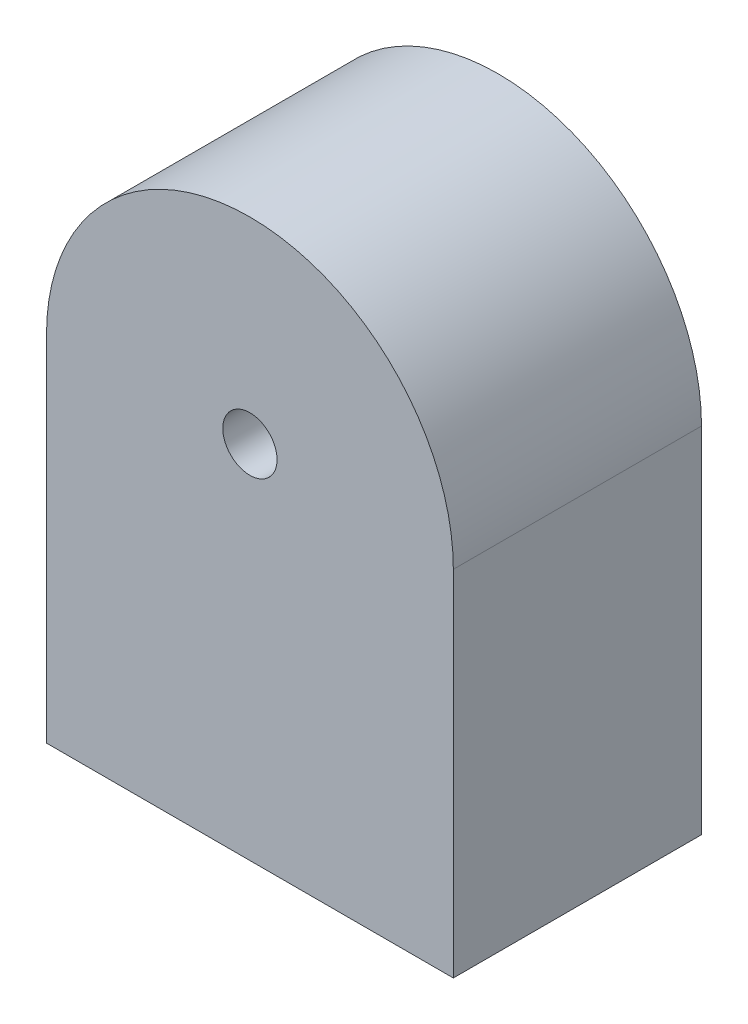
ISO-10303-21;
HEADER;
FILE_DESCRIPTION(('STEP AP214'),'2;1');
FILE_NAME('part.step','',(''),(''),'','','');
FILE_SCHEMA(('AUTOMOTIVE_DESIGN { 1 0 10303 214 1 1 1 1 }'));
ENDSEC;
DATA;
#1=APPLICATION_CONTEXT('core data for automotive mechanical design processes');
#2=APPLICATION_PROTOCOL_DEFINITION('international standard','automotive_design',2000,#1);
#3=PRODUCT_CONTEXT('',#1,'mechanical');
#4=PRODUCT('Part','Part','',(#3));
#5=PRODUCT_RELATED_PRODUCT_CATEGORY('part','',(#4));
#6=PRODUCT_DEFINITION_FORMATION('','',#4);
#7=PRODUCT_DEFINITION_CONTEXT('part definition',#1,'design');
#8=PRODUCT_DEFINITION('design','',#6,#7);
#9=PRODUCT_DEFINITION_SHAPE('','',#8);
#10=(LENGTH_UNIT() NAMED_UNIT(*) SI_UNIT(.MILLI.,.METRE.));
#11=(NAMED_UNIT(*) PLANE_ANGLE_UNIT() SI_UNIT($,.RADIAN.));
#12=(NAMED_UNIT(*) SI_UNIT($,.STERADIAN.) SOLID_ANGLE_UNIT());
#13=UNCERTAINTY_MEASURE_WITH_UNIT(LENGTH_MEASURE(1.E-05),#10,'distance_accuracy_value','');
#14=(GEOMETRIC_REPRESENTATION_CONTEXT(3) GLOBAL_UNCERTAINTY_ASSIGNED_CONTEXT((#13)) GLOBAL_UNIT_ASSIGNED_CONTEXT((#10,
#11,#12)) REPRESENTATION_CONTEXT('',''));
#15=CARTESIAN_POINT('',(0.,0.,0.));
#16=DIRECTION('',(0.,0.,1.));
#17=DIRECTION('',(1.,0.,0.));
#18=AXIS2_PLACEMENT_3D('',#15,#16,#17);
#19=CARTESIAN_POINT('',(0.,0.,-18.3));
#20=DIRECTION('',(-1.,0.,0.));
#21=DIRECTION('',(0.,0.,1.));
#22=AXIS2_PLACEMENT_3D('',#19,#20,#21);
#23=PLANE('',#22);
#24=DIRECTION('',(0.,-1.,0.));
#25=VECTOR('',#24,1.);
#26=CARTESIAN_POINT('',(0.,0.,0.));
#27=LINE('',#26,#25);
#28=CARTESIAN_POINT('',(0.,26.1,0.));
#29=VERTEX_POINT('',#28);
#30=CARTESIAN_POINT('',(0.,0.,0.));
#31=VERTEX_POINT('',#30);
#32=EDGE_CURVE('E99',#29,#31,#27,.T.);
#33=ORIENTED_EDGE('',*,*,#32,.F.);
#34=DIRECTION('',(0.,0.,1.));
#35=VECTOR('',#34,1.);
#36=CARTESIAN_POINT('',(0.,26.1,-18.3));
#37=LINE('',#36,#35);
#38=CARTESIAN_POINT('',(0.,26.1,-18.3));
#39=VERTEX_POINT('',#38);
#40=EDGE_CURVE('E11',#39,#29,#37,.T.);
#41=ORIENTED_EDGE('',*,*,#40,.F.);
#42=DIRECTION('',(0.,-1.,0.));
#43=VECTOR('',#42,1.);
#44=CARTESIAN_POINT('',(0.,0.,-18.3));
#45=LINE('',#44,#43);
#46=CARTESIAN_POINT('',(0.,0.,-18.3));
#47=VERTEX_POINT('',#46);
#48=EDGE_CURVE('E92',#39,#47,#45,.T.);
#49=ORIENTED_EDGE('',*,*,#48,.T.);
#50=DIRECTION('',(0.,0.,1.));
#51=VECTOR('',#50,1.);
#52=CARTESIAN_POINT('',(0.,0.,-18.3));
#53=LINE('',#52,#51);
#54=EDGE_CURVE('E37',#47,#31,#53,.T.);
#55=ORIENTED_EDGE('',*,*,#54,.T.);
#56=EDGE_LOOP('',(#33,#41,#49,#55));
#57=FACE_BOUND('',#56,.T.);
#58=ADVANCED_FACE('F34',(#57),#23,.T.);
#59=CARTESIAN_POINT('',(15.,26.1,-18.3));
#60=DIRECTION('',(0.,0.,1.));
#61=DIRECTION('',(1.,0.,0.));
#62=AXIS2_PLACEMENT_3D('',#59,#60,#61);
#63=CYLINDRICAL_SURFACE('',#62,15.);
#64=CARTESIAN_POINT('',(15.,26.1,0.));
#65=DIRECTION('',(0.,0.,1.));
#66=DIRECTION('',(-1.,0.,0.));
#67=AXIS2_PLACEMENT_3D('',#64,#65,#66);
#68=CIRCLE('',#67,15.);
#69=CARTESIAN_POINT('',(30.,26.1,0.));
#70=VERTEX_POINT('',#69);
#71=EDGE_CURVE('E94',#70,#29,#68,.T.);
#72=ORIENTED_EDGE('',*,*,#71,.F.);
#73=DIRECTION('',(0.,0.,1.));
#74=VECTOR('',#73,1.);
#75=CARTESIAN_POINT('',(30.,26.1,-18.3));
#76=LINE('',#75,#74);
#77=CARTESIAN_POINT('',(30.,26.1,-18.3));
#78=VERTEX_POINT('',#77);
#79=EDGE_CURVE('E43',#78,#70,#76,.T.);
#80=ORIENTED_EDGE('',*,*,#79,.F.);
#81=CARTESIAN_POINT('',(15.,26.1,-18.3));
#82=DIRECTION('',(0.,0.,1.));
#83=DIRECTION('',(-1.,0.,0.));
#84=AXIS2_PLACEMENT_3D('',#81,#82,#83);
#85=CIRCLE('',#84,15.);
#86=EDGE_CURVE('E89',#78,#39,#85,.T.);
#87=ORIENTED_EDGE('',*,*,#86,.T.);
#88=ORIENTED_EDGE('',*,*,#40,.T.);
#89=EDGE_LOOP('',(#72,#80,#87,#88));
#90=FACE_BOUND('',#89,.T.);
#91=ADVANCED_FACE('F110',(#90),#63,.T.);
#92=CARTESIAN_POINT('',(30.,0.,-18.3));
#93=DIRECTION('',(1.,0.,0.));
#94=DIRECTION('',(0.,0.,-1.));
#95=AXIS2_PLACEMENT_3D('',#92,#93,#94);
#96=PLANE('',#95);
#97=DIRECTION('',(0.,1.,0.));
#98=VECTOR('',#97,1.);
#99=CARTESIAN_POINT('',(30.,0.,0.));
#100=LINE('',#99,#98);
#101=CARTESIAN_POINT('',(30.,0.,0.));
#102=VERTEX_POINT('',#101);
#103=EDGE_CURVE('E84',#102,#70,#100,.T.);
#104=ORIENTED_EDGE('',*,*,#103,.F.);
#105=DIRECTION('',(0.,0.,1.));
#106=VECTOR('',#105,1.);
#107=CARTESIAN_POINT('',(30.,0.,-18.3));
#108=LINE('',#107,#106);
#109=CARTESIAN_POINT('',(30.,0.,-18.3));
#110=VERTEX_POINT('',#109);
#111=EDGE_CURVE('E79',#110,#102,#108,.T.);
#112=ORIENTED_EDGE('',*,*,#111,.F.);
#113=DIRECTION('',(0.,1.,0.));
#114=VECTOR('',#113,1.);
#115=CARTESIAN_POINT('',(30.,0.,-18.3));
#116=LINE('',#115,#114);
#117=EDGE_CURVE('E82',#110,#78,#116,.T.);
#118=ORIENTED_EDGE('',*,*,#117,.T.);
#119=ORIENTED_EDGE('',*,*,#79,.T.);
#120=EDGE_LOOP('',(#104,#112,#118,#119));
#121=FACE_BOUND('',#120,.T.);
#122=ADVANCED_FACE('F81',(#121),#96,.T.);
#123=CARTESIAN_POINT('',(0.,0.,-18.3));
#124=DIRECTION('',(0.,-1.,0.));
#125=DIRECTION('',(0.,0.,-1.));
#126=AXIS2_PLACEMENT_3D('',#123,#124,#125);
#127=PLANE('',#126);
#128=DIRECTION('',(1.,0.,0.));
#129=VECTOR('',#128,1.);
#130=CARTESIAN_POINT('',(0.,0.,0.));
#131=LINE('',#130,#129);
#132=EDGE_CURVE('E102',#31,#102,#131,.T.);
#133=ORIENTED_EDGE('',*,*,#132,.F.);
#134=ORIENTED_EDGE('',*,*,#54,.F.);
#135=DIRECTION('',(1.,0.,0.));
#136=VECTOR('',#135,1.);
#137=CARTESIAN_POINT('',(0.,0.,-18.3));
#138=LINE('',#137,#136);
#139=EDGE_CURVE('E88',#47,#110,#138,.T.);
#140=ORIENTED_EDGE('',*,*,#139,.T.);
#141=ORIENTED_EDGE('',*,*,#111,.T.);
#142=EDGE_LOOP('',(#133,#134,#140,#141));
#143=FACE_BOUND('',#142,.T.);
#144=ADVANCED_FACE('F91',(#143),#127,.T.);
#145=CARTESIAN_POINT('',(15.,26.1,-18.3));
#146=DIRECTION('',(0.,0.,-1.));
#147=DIRECTION('',(-1.,0.,0.));
#148=AXIS2_PLACEMENT_3D('',#145,#146,#147);
#149=PLANE('',#148);
#150=ORIENTED_EDGE('',*,*,#48,.F.);
#151=ORIENTED_EDGE('',*,*,#86,.F.);
#152=ORIENTED_EDGE('',*,*,#117,.F.);
#153=ORIENTED_EDGE('',*,*,#139,.F.);
#154=EDGE_LOOP('',(#150,#151,#152,#153));
#155=FACE_BOUND('',#154,.T.);
#156=ADVANCED_FACE('F87',(#155),#149,.T.);
#157=CARTESIAN_POINT('',(15.,26.1,0.));
#158=DIRECTION('',(0.,0.,-1.));
#159=DIRECTION('',(-1.,0.,0.));
#160=AXIS2_PLACEMENT_3D('',#157,#158,#159);
#161=PLANE('',#160);
#162=CARTESIAN_POINT('',(15.,26.6,0.));
#163=DIRECTION('',(0.,0.,1.));
#164=DIRECTION('',(1.,0.,0.));
#165=AXIS2_PLACEMENT_3D('',#162,#163,#164);
#166=CIRCLE('',#165,2.);
#167=CARTESIAN_POINT('',(17.,26.6,0.));
#168=VERTEX_POINT('',#167);
#169=EDGE_CURVE('E140',#168,#168,#166,.T.);
#170=ORIENTED_EDGE('',*,*,#169,.F.);
#171=EDGE_LOOP('',(#170));
#172=FACE_BOUND('',#171,.T.);
#173=ORIENTED_EDGE('',*,*,#32,.T.);
#174=ORIENTED_EDGE('',*,*,#132,.T.);
#175=ORIENTED_EDGE('',*,*,#103,.T.);
#176=ORIENTED_EDGE('',*,*,#71,.T.);
#177=EDGE_LOOP('',(#173,#174,#175,#176));
#178=FACE_BOUND('',#177,.T.);
#179=ADVANCED_FACE('F109',(#172,#178),#161,.F.);
#180=CARTESIAN_POINT('',(15.,26.6,-6.3));
#181=DIRECTION('',(0.,0.,1.));
#182=DIRECTION('',(1.,0.,0.));
#183=AXIS2_PLACEMENT_3D('',#180,#181,#182);
#184=CYLINDRICAL_SURFACE('',#183,2.);
#185=CARTESIAN_POINT('',(15.,26.6,-6.3));
#186=DIRECTION('',(0.,0.,1.));
#187=DIRECTION('',(1.,0.,0.));
#188=AXIS2_PLACEMENT_3D('',#185,#186,#187);
#189=CIRCLE('',#188,2.);
#190=CARTESIAN_POINT('',(17.,26.6,-6.3));
#191=VERTEX_POINT('',#190);
#192=EDGE_CURVE('E103',#191,#191,#189,.T.);
#193=ORIENTED_EDGE('',*,*,#192,.F.);
#194=EDGE_LOOP('',(#193));
#195=FACE_BOUND('',#194,.T.);
#196=ORIENTED_EDGE('',*,*,#169,.T.);
#197=EDGE_LOOP('',(#196));
#198=FACE_BOUND('',#197,.T.);
#199=ADVANCED_FACE('F127',(#195,#198),#184,.F.);
#200=CARTESIAN_POINT('',(15.,26.6,-6.3));
#201=DIRECTION('',(0.,0.,1.));
#202=DIRECTION('',(1.,0.,0.));
#203=AXIS2_PLACEMENT_3D('',#200,#201,#202);
#204=PLANE('',#203);
#205=ORIENTED_EDGE('',*,*,#192,.T.);
#206=EDGE_LOOP('',(#205));
#207=FACE_BOUND('',#206,.T.);
#208=ADVANCED_FACE('F132',(#207),#204,.T.);
#209=CLOSED_SHELL('',(#58,#91,#122,#144,#156,#179,#199,#208));
#210=MANIFOLD_SOLID_BREP('B2',#209);
#211=ADVANCED_BREP_SHAPE_REPRESENTATION('',(#18,#210),#14);
#212=SHAPE_DEFINITION_REPRESENTATION(#9,#211);
ENDSEC;
END-ISO-10303-21;
